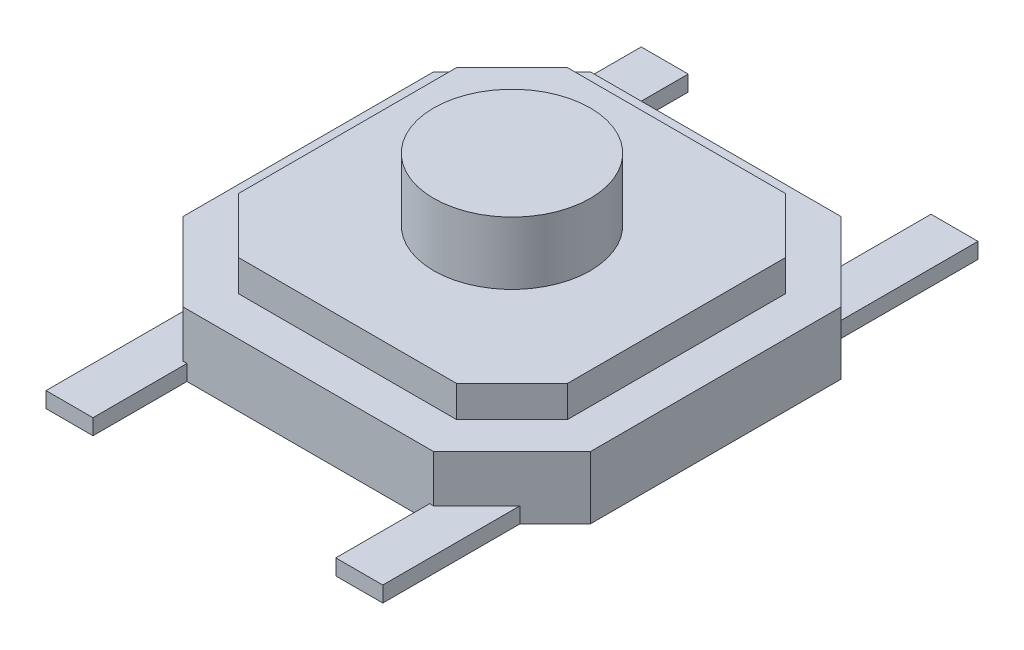
ISO-10303-21;
HEADER;
FILE_DESCRIPTION(('STEP AP214'),'2;1');
FILE_NAME('part.step','',(''),(''),'','','');
FILE_SCHEMA(('AUTOMOTIVE_DESIGN { 1 0 10303 214 1 1 1 1 }'));
ENDSEC;
DATA;
#1=APPLICATION_CONTEXT('core data for automotive mechanical design processes');
#2=APPLICATION_PROTOCOL_DEFINITION('international standard','automotive_design',2000,#1);
#3=PRODUCT_CONTEXT('',#1,'mechanical');
#4=PRODUCT('Part','Part','',(#3));
#5=PRODUCT_RELATED_PRODUCT_CATEGORY('part','',(#4));
#6=PRODUCT_DEFINITION_FORMATION('','',#4);
#7=PRODUCT_DEFINITION_CONTEXT('part definition',#1,'design');
#8=PRODUCT_DEFINITION('design','',#6,#7);
#9=PRODUCT_DEFINITION_SHAPE('','',#8);
#10=(LENGTH_UNIT() NAMED_UNIT(*) SI_UNIT(.MILLI.,.METRE.));
#11=(NAMED_UNIT(*) PLANE_ANGLE_UNIT() SI_UNIT($,.RADIAN.));
#12=(NAMED_UNIT(*) SI_UNIT($,.STERADIAN.) SOLID_ANGLE_UNIT());
#13=UNCERTAINTY_MEASURE_WITH_UNIT(LENGTH_MEASURE(1.E-05),#10,'distance_accuracy_value','');
#14=(GEOMETRIC_REPRESENTATION_CONTEXT(3) GLOBAL_UNCERTAINTY_ASSIGNED_CONTEXT((#13)) GLOBAL_UNIT_ASSIGNED_CONTEXT((#10,
#11,#12)) REPRESENTATION_CONTEXT('',''));
#15=CARTESIAN_POINT('',(0.,0.,0.));
#16=DIRECTION('',(0.,0.,1.));
#17=DIRECTION('',(1.,0.,0.));
#18=AXIS2_PLACEMENT_3D('',#15,#16,#17);
#19=CARTESIAN_POINT('',(-2.6,1.2,-2.60000000000001));
#20=DIRECTION('',(0.,1.,0.));
#21=DIRECTION('',(0.,0.,1.));
#22=AXIS2_PLACEMENT_3D('',#19,#20,#21);
#23=PLANE('',#22);
#24=DIRECTION('',(-1.,0.,0.));
#25=VECTOR('',#24,1.);
#26=CARTESIAN_POINT('',(1.39289321881345,1.2,-2.10000000000001));
#27=LINE('',#26,#25);
#28=CARTESIAN_POINT('',(1.39289321881345,1.2,-2.10000000000001));
#29=VERTEX_POINT('',#28);
#30=CARTESIAN_POINT('',(-1.39289321881345,1.2,-2.10000000000001));
#31=VERTEX_POINT('',#30);
#32=EDGE_CURVE('E363',#29,#31,#27,.T.);
#33=ORIENTED_EDGE('',*,*,#32,.T.);
#34=DIRECTION('',(-0.707106781186549,0.,0.707106781186546));
#35=VECTOR('',#34,1.);
#36=CARTESIAN_POINT('',(-1.39289321881345,1.2,-2.10000000000001));
#37=LINE('',#36,#35);
#38=CARTESIAN_POINT('',(-2.1,1.2,-1.39289321881346));
#39=VERTEX_POINT('',#38);
#40=EDGE_CURVE('E410',#31,#39,#37,.T.);
#41=ORIENTED_EDGE('',*,*,#40,.T.);
#42=DIRECTION('',(0.,0.,1.));
#43=VECTOR('',#42,1.);
#44=CARTESIAN_POINT('',(-2.1,1.2,-1.39289321881346));
#45=LINE('',#44,#43);
#46=CARTESIAN_POINT('',(-2.1,1.2,1.39289321881344));
#47=VERTEX_POINT('',#46);
#48=EDGE_CURVE('E407',#39,#47,#45,.T.);
#49=ORIENTED_EDGE('',*,*,#48,.T.);
#50=DIRECTION('',(0.707106781186546,0.,0.707106781186549));
#51=VECTOR('',#50,1.);
#52=CARTESIAN_POINT('',(-2.1,1.2,1.39289321881344));
#53=LINE('',#52,#51);
#54=CARTESIAN_POINT('',(-1.39289321881345,1.2,2.09999999999999));
#55=VERTEX_POINT('',#54);
#56=EDGE_CURVE('E404',#47,#55,#53,.T.);
#57=ORIENTED_EDGE('',*,*,#56,.T.);
#58=DIRECTION('',(1.,0.,0.));
#59=VECTOR('',#58,1.);
#60=CARTESIAN_POINT('',(-1.39289321881345,1.2,2.09999999999999));
#61=LINE('',#60,#59);
#62=CARTESIAN_POINT('',(1.39289321881347,1.2,2.09999999999999));
#63=VERTEX_POINT('',#62);
#64=EDGE_CURVE('E401',#55,#63,#61,.T.);
#65=ORIENTED_EDGE('',*,*,#64,.T.);
#66=DIRECTION('',(0.707106781186549,0.,-0.707106781186546));
#67=VECTOR('',#66,1.);
#68=CARTESIAN_POINT('',(1.39289321881347,1.2,2.09999999999999));
#69=LINE('',#68,#67);
#70=CARTESIAN_POINT('',(2.10000000000002,1.2,1.39289321881345));
#71=VERTEX_POINT('',#70);
#72=EDGE_CURVE('E398',#63,#71,#69,.T.);
#73=ORIENTED_EDGE('',*,*,#72,.T.);
#74=DIRECTION('',(0.,0.,-1.));
#75=VECTOR('',#74,1.);
#76=CARTESIAN_POINT('',(2.10000000000002,1.2,1.39289321881345));
#77=LINE('',#76,#75);
#78=CARTESIAN_POINT('',(2.1,1.2,-1.39289321881346));
#79=VERTEX_POINT('',#78);
#80=EDGE_CURVE('E395',#71,#79,#77,.T.);
#81=ORIENTED_EDGE('',*,*,#80,.T.);
#82=DIRECTION('',(-0.70710678118655,0.,-0.707106781186545));
#83=VECTOR('',#82,1.);
#84=CARTESIAN_POINT('',(2.1,1.2,-1.39289321881346));
#85=LINE('',#84,#83);
#86=EDGE_CURVE('E391',#79,#29,#85,.T.);
#87=ORIENTED_EDGE('',*,*,#86,.T.);
#88=EDGE_LOOP('',(#33,#41,#49,#57,#65,#73,#81,#87));
#89=FACE_BOUND('',#88,.T.);
#90=CARTESIAN_POINT('',(0.,1.2,0.));
#91=DIRECTION('',(0.,1.,0.));
#92=DIRECTION('',(0.,0.,1.));
#93=AXIS2_PLACEMENT_3D('',#90,#91,#92);
#94=CIRCLE('',#93,1.);
#95=CARTESIAN_POINT('',(0.,1.2,1.));
#96=VERTEX_POINT('',#95);
#97=EDGE_CURVE('E353',#96,#96,#94,.T.);
#98=ORIENTED_EDGE('',*,*,#97,.F.);
#99=EDGE_LOOP('',(#98));
#100=FACE_BOUND('',#99,.T.);
#101=ADVANCED_FACE('F35',(#89,#100),#23,.T.);
#102=CARTESIAN_POINT('',(-2.6,0.8,-2.60000000000001));
#103=DIRECTION('',(0.,1.,0.));
#104=DIRECTION('',(0.,0.,1.));
#105=AXIS2_PLACEMENT_3D('',#102,#103,#104);
#106=PLANE('',#105);
#107=DIRECTION('',(0.,0.,-1.));
#108=VECTOR('',#107,1.);
#109=CARTESIAN_POINT('',(2.6,0.8,-2.60000000000001));
#110=LINE('',#109,#108);
#111=CARTESIAN_POINT('',(2.60000000000002,0.8,1.6));
#112=VERTEX_POINT('',#111);
#113=CARTESIAN_POINT('',(2.6,0.8,-1.6));
#114=VERTEX_POINT('',#113);
#115=EDGE_CURVE('E431',#112,#114,#110,.T.);
#116=ORIENTED_EDGE('',*,*,#115,.T.);
#117=DIRECTION('',(0.70710678118655,0.,0.707106781186545));
#118=VECTOR('',#117,1.);
#119=CARTESIAN_POINT('',(-0.500000000000016,0.8,-4.7));
#120=LINE('',#119,#118);
#121=CARTESIAN_POINT('',(1.59999999999999,0.8,-2.60000000000001));
#122=VERTEX_POINT('',#121);
#123=EDGE_CURVE('E473',#114,#122,#120,.F.);
#124=ORIENTED_EDGE('',*,*,#123,.T.);
#125=DIRECTION('',(-1.,0.,0.));
#126=VECTOR('',#125,1.);
#127=CARTESIAN_POINT('',(-2.6,0.8,-2.60000000000001));
#128=LINE('',#127,#126);
#129=CARTESIAN_POINT('',(-1.6,0.8,-2.60000000000001));
#130=VERTEX_POINT('',#129);
#131=EDGE_CURVE('E434',#122,#130,#128,.T.);
#132=ORIENTED_EDGE('',*,*,#131,.T.);
#133=DIRECTION('',(0.707106781186549,0.,-0.707106781186546));
#134=VECTOR('',#133,1.);
#135=CARTESIAN_POINT('',(-2.1,0.8,-2.10000000000001));
#136=LINE('',#135,#134);
#137=CARTESIAN_POINT('',(-2.6,0.8,-1.60000000000001));
#138=VERTEX_POINT('',#137);
#139=EDGE_CURVE('E467',#130,#138,#136,.F.);
#140=ORIENTED_EDGE('',*,*,#139,.T.);
#141=DIRECTION('',(0.,0.,1.));
#142=VECTOR('',#141,1.);
#143=CARTESIAN_POINT('',(-2.6,0.8,-2.60000000000001));
#144=LINE('',#143,#142);
#145=CARTESIAN_POINT('',(-2.6,0.8,1.59999999999999));
#146=VERTEX_POINT('',#145);
#147=EDGE_CURVE('E424',#138,#146,#144,.T.);
#148=ORIENTED_EDGE('',*,*,#147,.T.);
#149=DIRECTION('',(-0.707106781186547,0.,-0.707106781186548));
#150=VECTOR('',#149,1.);
#151=CARTESIAN_POINT('',(-4.7,0.8,-0.500000000000014));
#152=LINE('',#151,#150);
#153=CARTESIAN_POINT('',(-1.6,0.8,2.59999999999999));
#154=VERTEX_POINT('',#153);
#155=EDGE_CURVE('E469',#146,#154,#152,.F.);
#156=ORIENTED_EDGE('',*,*,#155,.T.);
#157=DIRECTION('',(1.,0.,0.));
#158=VECTOR('',#157,1.);
#159=CARTESIAN_POINT('',(-2.6,0.8,2.59999999999999));
#160=LINE('',#159,#158);
#161=CARTESIAN_POINT('',(1.60000000000002,0.8,2.59999999999999));
#162=VERTEX_POINT('',#161);
#163=EDGE_CURVE('E427',#154,#162,#160,.T.);
#164=ORIENTED_EDGE('',*,*,#163,.T.);
#165=DIRECTION('',(-0.707106781186549,0.,0.707106781186546));
#166=VECTOR('',#165,1.);
#167=CARTESIAN_POINT('',(2.1,0.8,2.10000000000001));
#168=LINE('',#167,#166);
#169=EDGE_CURVE('E471',#162,#112,#168,.F.);
#170=ORIENTED_EDGE('',*,*,#169,.T.);
#171=EDGE_LOOP('',(#116,#124,#132,#140,#148,#156,#164,#170));
#172=FACE_BOUND('',#171,.T.);
#173=DIRECTION('',(0.,0.,1.));
#174=VECTOR('',#173,1.);
#175=CARTESIAN_POINT('',(-2.1,0.8,-1.39289321881346));
#176=LINE('',#175,#174);
#177=CARTESIAN_POINT('',(-2.1,0.8,-1.39289321881346));
#178=VERTEX_POINT('',#177);
#179=CARTESIAN_POINT('',(-2.1,0.8,1.39289321881344));
#180=VERTEX_POINT('',#179);
#181=EDGE_CURVE('E384',#178,#180,#176,.T.);
#182=ORIENTED_EDGE('',*,*,#181,.F.);
#183=DIRECTION('',(-0.707106781186549,0.,0.707106781186546));
#184=VECTOR('',#183,1.);
#185=CARTESIAN_POINT('',(-1.39289321881345,0.8,-2.10000000000001));
#186=LINE('',#185,#184);
#187=CARTESIAN_POINT('',(-1.39289321881345,0.8,-2.10000000000001));
#188=VERTEX_POINT('',#187);
#189=EDGE_CURVE('E388',#188,#178,#186,.T.);
#190=ORIENTED_EDGE('',*,*,#189,.F.);
#191=DIRECTION('',(-1.,0.,0.));
#192=VECTOR('',#191,1.);
#193=CARTESIAN_POINT('',(1.39289321881345,0.8,-2.10000000000001));
#194=LINE('',#193,#192);
#195=CARTESIAN_POINT('',(1.39289321881345,0.8,-2.10000000000001));
#196=VERTEX_POINT('',#195);
#197=EDGE_CURVE('E360',#196,#188,#194,.T.);
#198=ORIENTED_EDGE('',*,*,#197,.F.);
#199=DIRECTION('',(-0.70710678118655,0.,-0.707106781186545));
#200=VECTOR('',#199,1.);
#201=CARTESIAN_POINT('',(2.1,0.8,-1.39289321881346));
#202=LINE('',#201,#200);
#203=CARTESIAN_POINT('',(2.1,0.8,-1.39289321881346));
#204=VERTEX_POINT('',#203);
#205=EDGE_CURVE('E365',#204,#196,#202,.T.);
#206=ORIENTED_EDGE('',*,*,#205,.F.);
#207=DIRECTION('',(0.,0.,-1.));
#208=VECTOR('',#207,1.);
#209=CARTESIAN_POINT('',(2.10000000000002,0.8,1.39289321881345));
#210=LINE('',#209,#208);
#211=CARTESIAN_POINT('',(2.10000000000002,0.8,1.39289321881345));
#212=VERTEX_POINT('',#211);
#213=EDGE_CURVE('E368',#212,#204,#210,.T.);
#214=ORIENTED_EDGE('',*,*,#213,.F.);
#215=DIRECTION('',(0.707106781186549,0.,-0.707106781186546));
#216=VECTOR('',#215,1.);
#217=CARTESIAN_POINT('',(1.39289321881347,0.8,2.09999999999999));
#218=LINE('',#217,#216);
#219=CARTESIAN_POINT('',(1.39289321881347,0.8,2.09999999999999));
#220=VERTEX_POINT('',#219);
#221=EDGE_CURVE('E372',#220,#212,#218,.T.);
#222=ORIENTED_EDGE('',*,*,#221,.F.);
#223=DIRECTION('',(1.,0.,0.));
#224=VECTOR('',#223,1.);
#225=CARTESIAN_POINT('',(-1.39289321881345,0.8,2.09999999999999));
#226=LINE('',#225,#224);
#227=CARTESIAN_POINT('',(-1.39289321881345,0.8,2.09999999999999));
#228=VERTEX_POINT('',#227);
#229=EDGE_CURVE('E376',#228,#220,#226,.T.);
#230=ORIENTED_EDGE('',*,*,#229,.F.);
#231=DIRECTION('',(0.707106781186546,0.,0.707106781186549));
#232=VECTOR('',#231,1.);
#233=CARTESIAN_POINT('',(-2.1,0.8,1.39289321881344));
#234=LINE('',#233,#232);
#235=EDGE_CURVE('E380',#180,#228,#234,.T.);
#236=ORIENTED_EDGE('',*,*,#235,.F.);
#237=EDGE_LOOP('',(#182,#190,#198,#206,#214,#222,#230,#236));
#238=FACE_BOUND('',#237,.T.);
#239=ADVANCED_FACE('F519',(#172,#238),#106,.T.);
#240=CARTESIAN_POINT('',(-2.6,0.8,-2.60000000000001));
#241=DIRECTION('',(1.,0.,0.));
#242=DIRECTION('',(0.,0.,-1.));
#243=AXIS2_PLACEMENT_3D('',#240,#241,#242);
#244=PLANE('',#243);
#245=DIRECTION('',(0.,0.,1.));
#246=VECTOR('',#245,1.);
#247=CARTESIAN_POINT('',(-2.6,0.,-2.60000000000001));
#248=LINE('',#247,#246);
#249=CARTESIAN_POINT('',(-2.6,0.,-1.60000000000001));
#250=VERTEX_POINT('',#249);
#251=CARTESIAN_POINT('',(-2.6,0.,1.59999999999999));
#252=VERTEX_POINT('',#251);
#253=EDGE_CURVE('E394',#250,#252,#248,.T.);
#254=ORIENTED_EDGE('',*,*,#253,.T.);
#255=DIRECTION('',(0.,1.,0.));
#256=VECTOR('',#255,1.);
#257=CARTESIAN_POINT('',(-2.6,0.8,1.59999999999999));
#258=LINE('',#257,#256);
#259=EDGE_CURVE('E483',#252,#146,#258,.T.);
#260=ORIENTED_EDGE('',*,*,#259,.T.);
#261=ORIENTED_EDGE('',*,*,#147,.F.);
#262=DIRECTION('',(0.,-1.,0.));
#263=VECTOR('',#262,1.);
#264=CARTESIAN_POINT('',(-2.6,0.8,-1.60000000000001));
#265=LINE('',#264,#263);
#266=EDGE_CURVE('E480',#138,#250,#265,.T.);
#267=ORIENTED_EDGE('',*,*,#266,.T.);
#268=EDGE_LOOP('',(#254,#260,#261,#267));
#269=FACE_BOUND('',#268,.T.);
#270=ADVANCED_FACE('F515',(#269),#244,.F.);
#271=CARTESIAN_POINT('',(-2.6,0.8,2.59999999999999));
#272=DIRECTION('',(0.,0.,-1.));
#273=DIRECTION('',(-1.,0.,0.));
#274=AXIS2_PLACEMENT_3D('',#271,#272,#273);
#275=PLANE('',#274);
#276=DIRECTION('',(1.,0.,0.));
#277=VECTOR('',#276,1.);
#278=CARTESIAN_POINT('',(-2.6,0.,2.59999999999999));
#279=LINE('',#278,#277);
#280=CARTESIAN_POINT('',(-1.55,0.,2.59999999999999));
#281=VERTEX_POINT('',#280);
#282=CARTESIAN_POINT('',(1.55,0.,2.59999999999999));
#283=VERTEX_POINT('',#282);
#284=EDGE_CURVE('E440',#281,#283,#279,.T.);
#285=ORIENTED_EDGE('',*,*,#284,.T.);
#286=DIRECTION('',(0.,1.,0.));
#287=VECTOR('',#286,1.);
#288=CARTESIAN_POINT('',(1.55,0.8,2.59999999999999));
#289=LINE('',#288,#287);
#290=CARTESIAN_POINT('',(1.55,0.2,2.59999999999999));
#291=VERTEX_POINT('',#290);
#292=EDGE_CURVE('E327',#283,#291,#289,.T.);
#293=ORIENTED_EDGE('',*,*,#292,.T.);
#294=DIRECTION('',(-1.,0.,0.));
#295=VECTOR('',#294,1.);
#296=CARTESIAN_POINT('',(-2.6,0.2,2.59999999999999));
#297=LINE('',#296,#295);
#298=CARTESIAN_POINT('',(1.60000000000002,0.2,2.59999999999999));
#299=VERTEX_POINT('',#298);
#300=EDGE_CURVE('E323',#299,#291,#297,.T.);
#301=ORIENTED_EDGE('',*,*,#300,.F.);
#302=DIRECTION('',(0.,1.,0.));
#303=VECTOR('',#302,1.);
#304=CARTESIAN_POINT('',(1.60000000000002,0.8,2.59999999999999));
#305=LINE('',#304,#303);
#306=EDGE_CURVE('E478',#299,#162,#305,.T.);
#307=ORIENTED_EDGE('',*,*,#306,.T.);
#308=ORIENTED_EDGE('',*,*,#163,.F.);
#309=DIRECTION('',(0.,-1.,0.));
#310=VECTOR('',#309,1.);
#311=CARTESIAN_POINT('',(-1.6,0.8,2.59999999999999));
#312=LINE('',#311,#310);
#313=CARTESIAN_POINT('',(-1.6,0.2,2.59999999999999));
#314=VERTEX_POINT('',#313);
#315=EDGE_CURVE('E475',#154,#314,#312,.T.);
#316=ORIENTED_EDGE('',*,*,#315,.T.);
#317=DIRECTION('',(-1.,0.,0.));
#318=VECTOR('',#317,1.);
#319=CARTESIAN_POINT('',(-2.6,0.2,2.59999999999999));
#320=LINE('',#319,#318);
#321=CARTESIAN_POINT('',(-1.55,0.2,2.59999999999999));
#322=VERTEX_POINT('',#321);
#323=EDGE_CURVE('E346',#322,#314,#320,.T.);
#324=ORIENTED_EDGE('',*,*,#323,.F.);
#325=DIRECTION('',(0.,-1.,0.));
#326=VECTOR('',#325,1.);
#327=CARTESIAN_POINT('',(-1.55,0.8,2.59999999999999));
#328=LINE('',#327,#326);
#329=EDGE_CURVE('E350',#322,#281,#328,.T.);
#330=ORIENTED_EDGE('',*,*,#329,.T.);
#331=EDGE_LOOP('',(#285,#293,#301,#307,#308,#316,#324,#330));
#332=FACE_BOUND('',#331,.T.);
#333=ADVANCED_FACE('F529',(#332),#275,.F.);
#334=CARTESIAN_POINT('',(2.6,0.8,-2.60000000000001));
#335=DIRECTION('',(-1.,0.,0.));
#336=DIRECTION('',(0.,0.,1.));
#337=AXIS2_PLACEMENT_3D('',#334,#335,#336);
#338=PLANE('',#337);
#339=DIRECTION('',(0.,0.,-1.));
#340=VECTOR('',#339,1.);
#341=CARTESIAN_POINT('',(2.6,0.,-2.60000000000001));
#342=LINE('',#341,#340);
#343=CARTESIAN_POINT('',(2.60000000000002,0.,1.6));
#344=VERTEX_POINT('',#343);
#345=CARTESIAN_POINT('',(2.6,0.,-1.6));
#346=VERTEX_POINT('',#345);
#347=EDGE_CURVE('E443',#344,#346,#342,.T.);
#348=ORIENTED_EDGE('',*,*,#347,.T.);
#349=DIRECTION('',(0.,1.,0.));
#350=VECTOR('',#349,1.);
#351=CARTESIAN_POINT('',(2.6,0.8,-1.6));
#352=LINE('',#351,#350);
#353=EDGE_CURVE('E465',#346,#114,#352,.T.);
#354=ORIENTED_EDGE('',*,*,#353,.T.);
#355=ORIENTED_EDGE('',*,*,#115,.F.);
#356=DIRECTION('',(0.,-1.,0.));
#357=VECTOR('',#356,1.);
#358=CARTESIAN_POINT('',(2.60000000000002,0.8,1.6));
#359=LINE('',#358,#357);
#360=EDGE_CURVE('E462',#112,#344,#359,.T.);
#361=ORIENTED_EDGE('',*,*,#360,.T.);
#362=EDGE_LOOP('',(#348,#354,#355,#361));
#363=FACE_BOUND('',#362,.T.);
#364=ADVANCED_FACE('F540',(#363),#338,.F.);
#365=CARTESIAN_POINT('',(-2.6,0.8,-2.60000000000001));
#366=DIRECTION('',(0.,0.,1.));
#367=DIRECTION('',(1.,0.,0.));
#368=AXIS2_PLACEMENT_3D('',#365,#366,#367);
#369=PLANE('',#368);
#370=DIRECTION('',(-1.,0.,0.));
#371=VECTOR('',#370,1.);
#372=CARTESIAN_POINT('',(-2.6,0.,-2.60000000000001));
#373=LINE('',#372,#371);
#374=CARTESIAN_POINT('',(1.55,0.,-2.60000000000001));
#375=VERTEX_POINT('',#374);
#376=CARTESIAN_POINT('',(-1.55,0.,-2.60000000000001));
#377=VERTEX_POINT('',#376);
#378=EDGE_CURVE('E428',#375,#377,#373,.T.);
#379=ORIENTED_EDGE('',*,*,#378,.T.);
#380=DIRECTION('',(0.,1.,0.));
#381=VECTOR('',#380,1.);
#382=CARTESIAN_POINT('',(-1.55,0.8,-2.60000000000001));
#383=LINE('',#382,#381);
#384=CARTESIAN_POINT('',(-1.55,0.2,-2.60000000000001));
#385=VERTEX_POINT('',#384);
#386=EDGE_CURVE('E278',#377,#385,#383,.T.);
#387=ORIENTED_EDGE('',*,*,#386,.T.);
#388=DIRECTION('',(1.,0.,0.));
#389=VECTOR('',#388,1.);
#390=CARTESIAN_POINT('',(-2.6,0.2,-2.60000000000001));
#391=LINE('',#390,#389);
#392=CARTESIAN_POINT('',(-1.6,0.2,-2.60000000000001));
#393=VERTEX_POINT('',#392);
#394=EDGE_CURVE('E275',#393,#385,#391,.T.);
#395=ORIENTED_EDGE('',*,*,#394,.F.);
#396=DIRECTION('',(0.,1.,0.));
#397=VECTOR('',#396,1.);
#398=CARTESIAN_POINT('',(-1.6,0.8,-2.60000000000001));
#399=LINE('',#398,#397);
#400=EDGE_CURVE('E437',#393,#130,#399,.T.);
#401=ORIENTED_EDGE('',*,*,#400,.T.);
#402=ORIENTED_EDGE('',*,*,#131,.F.);
#403=DIRECTION('',(0.,-1.,0.));
#404=VECTOR('',#403,1.);
#405=CARTESIAN_POINT('',(1.59999999999999,0.8,-2.60000000000001));
#406=LINE('',#405,#404);
#407=CARTESIAN_POINT('',(1.59999999999999,0.2,-2.60000000000001));
#408=VERTEX_POINT('',#407);
#409=EDGE_CURVE('E449',#122,#408,#406,.T.);
#410=ORIENTED_EDGE('',*,*,#409,.T.);
#411=DIRECTION('',(1.,0.,0.));
#412=VECTOR('',#411,1.);
#413=CARTESIAN_POINT('',(-2.6,0.2,-2.60000000000001));
#414=LINE('',#413,#412);
#415=CARTESIAN_POINT('',(1.55,0.2,-2.60000000000001));
#416=VERTEX_POINT('',#415);
#417=EDGE_CURVE('E297',#416,#408,#414,.T.);
#418=ORIENTED_EDGE('',*,*,#417,.F.);
#419=DIRECTION('',(0.,-1.,0.));
#420=VECTOR('',#419,1.);
#421=CARTESIAN_POINT('',(1.55,0.8,-2.60000000000001));
#422=LINE('',#421,#420);
#423=EDGE_CURVE('E301',#416,#375,#422,.T.);
#424=ORIENTED_EDGE('',*,*,#423,.T.);
#425=EDGE_LOOP('',(#379,#387,#395,#401,#402,#410,#418,#424));
#426=FACE_BOUND('',#425,.T.);
#427=ADVANCED_FACE('F504',(#426),#369,.F.);
#428=CARTESIAN_POINT('',(-2.6,0.,-2.60000000000001));
#429=DIRECTION('',(0.,1.,0.));
#430=DIRECTION('',(0.,0.,1.));
#431=AXIS2_PLACEMENT_3D('',#428,#429,#430);
#432=PLANE('',#431);
#433=DIRECTION('',(0.,0.,1.));
#434=VECTOR('',#433,1.);
#435=CARTESIAN_POINT('',(-1.55,0.,-1.13168776971169));
#436=LINE('',#435,#434);
#437=CARTESIAN_POINT('',(-1.55,0.,-3.79999999999999));
#438=VERTEX_POINT('',#437);
#439=EDGE_CURVE('E254',#438,#377,#436,.T.);
#440=ORIENTED_EDGE('',*,*,#439,.T.);
#441=ORIENTED_EDGE('',*,*,#378,.F.);
#442=DIRECTION('',(0.,0.,-1.));
#443=VECTOR('',#442,1.);
#444=CARTESIAN_POINT('',(1.55,0.,-1.13168776971169));
#445=LINE('',#444,#443);
#446=CARTESIAN_POINT('',(1.55,0.,-3.79999999999999));
#447=VERTEX_POINT('',#446);
#448=EDGE_CURVE('E281',#375,#447,#445,.T.);
#449=ORIENTED_EDGE('',*,*,#448,.T.);
#450=DIRECTION('',(1.,0.,0.));
#451=VECTOR('',#450,1.);
#452=CARTESIAN_POINT('',(1.55,0.,-3.79999999999999));
#453=LINE('',#452,#451);
#454=CARTESIAN_POINT('',(2.15,0.,-3.79999999999999));
#455=VERTEX_POINT('',#454);
#456=EDGE_CURVE('E292',#447,#455,#453,.T.);
#457=ORIENTED_EDGE('',*,*,#456,.T.);
#458=DIRECTION('',(0.,0.,1.));
#459=VECTOR('',#458,1.);
#460=CARTESIAN_POINT('',(2.15,0.,-1.13168776971169));
#461=LINE('',#460,#459);
#462=CARTESIAN_POINT('',(2.15,0.,-2.05000000000001));
#463=VERTEX_POINT('',#462);
#464=EDGE_CURVE('E50',#455,#463,#461,.T.);
#465=ORIENTED_EDGE('',*,*,#464,.T.);
#466=DIRECTION('',(-0.70710678118655,0.,-0.707106781186545));
#467=VECTOR('',#466,1.);
#468=CARTESIAN_POINT('',(1.59999999999999,0.,-2.60000000000001));
#469=LINE('',#468,#467);
#470=EDGE_CURVE('E460',#463,#346,#469,.F.);
#471=ORIENTED_EDGE('',*,*,#470,.T.);
#472=ORIENTED_EDGE('',*,*,#347,.F.);
#473=DIRECTION('',(0.707106781186549,0.,-0.707106781186546));
#474=VECTOR('',#473,1.);
#475=CARTESIAN_POINT('',(2.60000000000002,0.,1.6));
#476=LINE('',#475,#474);
#477=CARTESIAN_POINT('',(2.15,0.,2.05000000000001));
#478=VERTEX_POINT('',#477);
#479=EDGE_CURVE('E457',#344,#478,#476,.F.);
#480=ORIENTED_EDGE('',*,*,#479,.T.);
#481=DIRECTION('',(0.,0.,1.));
#482=VECTOR('',#481,1.);
#483=CARTESIAN_POINT('',(2.15,0.,1.13168776971169));
#484=LINE('',#483,#482);
#485=CARTESIAN_POINT('',(2.15,0.,3.79999999999999));
#486=VERTEX_POINT('',#485);
#487=EDGE_CURVE('E304',#478,#486,#484,.T.);
#488=ORIENTED_EDGE('',*,*,#487,.T.);
#489=DIRECTION('',(-1.,0.,0.));
#490=VECTOR('',#489,1.);
#491=CARTESIAN_POINT('',(1.55,0.,3.79999999999999));
#492=LINE('',#491,#490);
#493=CARTESIAN_POINT('',(1.55,0.,3.79999999999999));
#494=VERTEX_POINT('',#493);
#495=EDGE_CURVE('E316',#486,#494,#492,.T.);
#496=ORIENTED_EDGE('',*,*,#495,.T.);
#497=DIRECTION('',(0.,0.,-1.));
#498=VECTOR('',#497,1.);
#499=CARTESIAN_POINT('',(1.55,0.,1.13168776971169));
#500=LINE('',#499,#498);
#501=EDGE_CURVE('E308',#494,#283,#500,.T.);
#502=ORIENTED_EDGE('',*,*,#501,.T.);
#503=ORIENTED_EDGE('',*,*,#284,.F.);
#504=DIRECTION('',(0.,0.,1.));
#505=VECTOR('',#504,1.);
#506=CARTESIAN_POINT('',(-1.55,0.,1.13168776971169));
#507=LINE('',#506,#505);
#508=CARTESIAN_POINT('',(-1.55,0.,3.79999999999999));
#509=VERTEX_POINT('',#508);
#510=EDGE_CURVE('E330',#281,#509,#507,.T.);
#511=ORIENTED_EDGE('',*,*,#510,.T.);
#512=DIRECTION('',(-1.,0.,0.));
#513=VECTOR('',#512,1.);
#514=CARTESIAN_POINT('',(-1.55,0.,3.79999999999999));
#515=LINE('',#514,#513);
#516=CARTESIAN_POINT('',(-2.15,0.,3.79999999999999));
#517=VERTEX_POINT('',#516);
#518=EDGE_CURVE('E341',#509,#517,#515,.T.);
#519=ORIENTED_EDGE('',*,*,#518,.T.);
#520=DIRECTION('',(0.,0.,-1.));
#521=VECTOR('',#520,1.);
#522=CARTESIAN_POINT('',(-2.15,0.,1.13168776971169));
#523=LINE('',#522,#521);
#524=CARTESIAN_POINT('',(-2.15,0.,2.04999999999999));
#525=VERTEX_POINT('',#524);
#526=EDGE_CURVE('E57',#517,#525,#523,.T.);
#527=ORIENTED_EDGE('',*,*,#526,.T.);
#528=DIRECTION('',(0.707106781186547,0.,0.707106781186548));
#529=VECTOR('',#528,1.);
#530=CARTESIAN_POINT('',(-1.6,0.,2.59999999999999));
#531=LINE('',#530,#529);
#532=EDGE_CURVE('E455',#525,#252,#531,.F.);
#533=ORIENTED_EDGE('',*,*,#532,.T.);
#534=ORIENTED_EDGE('',*,*,#253,.F.);
#535=DIRECTION('',(-0.707106781186549,0.,0.707106781186546));
#536=VECTOR('',#535,1.);
#537=CARTESIAN_POINT('',(-2.6,0.,-1.60000000000001));
#538=LINE('',#537,#536);
#539=CARTESIAN_POINT('',(-2.15,0.,-2.05000000000001));
#540=VERTEX_POINT('',#539);
#541=EDGE_CURVE('E452',#250,#540,#538,.F.);
#542=ORIENTED_EDGE('',*,*,#541,.T.);
#543=DIRECTION('',(0.,0.,-1.));
#544=VECTOR('',#543,1.);
#545=CARTESIAN_POINT('',(-2.15,0.,-1.13168776971169));
#546=LINE('',#545,#544);
#547=CARTESIAN_POINT('',(-2.15,0.,-3.79999999999999));
#548=VERTEX_POINT('',#547);
#549=EDGE_CURVE('E270',#540,#548,#546,.T.);
#550=ORIENTED_EDGE('',*,*,#549,.T.);
#551=DIRECTION('',(1.,0.,0.));
#552=VECTOR('',#551,1.);
#553=CARTESIAN_POINT('',(-1.55,0.,-3.79999999999999));
#554=LINE('',#553,#552);
#555=EDGE_CURVE('E261',#548,#438,#554,.T.);
#556=ORIENTED_EDGE('',*,*,#555,.T.);
#557=EDGE_LOOP('',(#440,#441,#449,#457,#465,#471,#472,#480,#488,#496,#502,#503,#511,#519,#527,
#533,#534,#542,#550,#556));
#558=FACE_BOUND('',#557,.T.);
#559=ADVANCED_FACE('F510',(#558),#432,.F.);
#560=CARTESIAN_POINT('',(1.59999999999999,0.8,-2.60000000000001));
#561=DIRECTION('',(-0.707106781186545,0.,0.70710678118655));
#562=DIRECTION('',(0.,-1.,0.));
#563=AXIS2_PLACEMENT_3D('',#560,#561,#562);
#564=PLANE('',#563);
#565=DIRECTION('',(0.,1.,0.));
#566=VECTOR('',#565,1.);
#567=CARTESIAN_POINT('',(2.15,0.8,-2.05000000000001));
#568=LINE('',#567,#566);
#569=CARTESIAN_POINT('',(2.15,0.2,-2.05000000000001));
#570=VERTEX_POINT('',#569);
#571=EDGE_CURVE('E498',#570,#463,#568,.F.);
#572=ORIENTED_EDGE('',*,*,#571,.F.);
#573=DIRECTION('',(0.70710678118655,0.,0.707106781186545));
#574=VECTOR('',#573,1.);
#575=CARTESIAN_POINT('',(1.59999999999999,0.2,-2.60000000000001));
#576=LINE('',#575,#574);
#577=EDGE_CURVE('E495',#570,#408,#576,.F.);
#578=ORIENTED_EDGE('',*,*,#577,.T.);
#579=ORIENTED_EDGE('',*,*,#409,.F.);
#580=ORIENTED_EDGE('',*,*,#123,.F.);
#581=ORIENTED_EDGE('',*,*,#353,.F.);
#582=ORIENTED_EDGE('',*,*,#470,.F.);
#583=EDGE_LOOP('',(#572,#578,#579,#580,#581,#582));
#584=FACE_BOUND('',#583,.T.);
#585=ADVANCED_FACE('F545',(#584),#564,.F.);
#586=CARTESIAN_POINT('',(2.60000000000002,0.8,1.6));
#587=DIRECTION('',(-0.707106781186546,0.,-0.707106781186549));
#588=DIRECTION('',(0.,-1.,0.));
#589=AXIS2_PLACEMENT_3D('',#586,#587,#588);
#590=PLANE('',#589);
#591=DIRECTION('',(0.,-1.,0.));
#592=VECTOR('',#591,1.);
#593=CARTESIAN_POINT('',(2.15,0.8,2.05000000000001));
#594=LINE('',#593,#592);
#595=CARTESIAN_POINT('',(2.15,0.2,2.05000000000001));
#596=VERTEX_POINT('',#595);
#597=EDGE_CURVE('E493',#478,#596,#594,.F.);
#598=ORIENTED_EDGE('',*,*,#597,.F.);
#599=ORIENTED_EDGE('',*,*,#479,.F.);
#600=ORIENTED_EDGE('',*,*,#360,.F.);
#601=ORIENTED_EDGE('',*,*,#169,.F.);
#602=ORIENTED_EDGE('',*,*,#306,.F.);
#603=DIRECTION('',(-0.707106781186549,0.,0.707106781186546));
#604=VECTOR('',#603,1.);
#605=CARTESIAN_POINT('',(2.60000000000002,0.2,1.6));
#606=LINE('',#605,#604);
#607=EDGE_CURVE('E490',#299,#596,#606,.F.);
#608=ORIENTED_EDGE('',*,*,#607,.T.);
#609=EDGE_LOOP('',(#598,#599,#600,#601,#602,#608));
#610=FACE_BOUND('',#609,.T.);
#611=ADVANCED_FACE('F537',(#610),#590,.F.);
#612=CARTESIAN_POINT('',(-1.6,0.8,2.59999999999999));
#613=DIRECTION('',(0.707106781186548,0.,-0.707106781186547));
#614=DIRECTION('',(0.,-1.,0.));
#615=AXIS2_PLACEMENT_3D('',#612,#613,#614);
#616=PLANE('',#615);
#617=DIRECTION('',(0.,1.,0.));
#618=VECTOR('',#617,1.);
#619=CARTESIAN_POINT('',(-2.15,0.8,2.04999999999999));
#620=LINE('',#619,#618);
#621=CARTESIAN_POINT('',(-2.15,0.2,2.04999999999999));
#622=VERTEX_POINT('',#621);
#623=EDGE_CURVE('E488',#622,#525,#620,.F.);
#624=ORIENTED_EDGE('',*,*,#623,.F.);
#625=DIRECTION('',(-0.707106781186547,0.,-0.707106781186548));
#626=VECTOR('',#625,1.);
#627=CARTESIAN_POINT('',(-1.6,0.2,2.59999999999999));
#628=LINE('',#627,#626);
#629=EDGE_CURVE('E485',#622,#314,#628,.F.);
#630=ORIENTED_EDGE('',*,*,#629,.T.);
#631=ORIENTED_EDGE('',*,*,#315,.F.);
#632=ORIENTED_EDGE('',*,*,#155,.F.);
#633=ORIENTED_EDGE('',*,*,#259,.F.);
#634=ORIENTED_EDGE('',*,*,#532,.F.);
#635=EDGE_LOOP('',(#624,#630,#631,#632,#633,#634));
#636=FACE_BOUND('',#635,.T.);
#637=ADVANCED_FACE('F525',(#636),#616,.F.);
#638=CARTESIAN_POINT('',(-2.6,0.8,-1.60000000000001));
#639=DIRECTION('',(0.707106781186546,0.,0.707106781186549));
#640=DIRECTION('',(0.,-1.,0.));
#641=AXIS2_PLACEMENT_3D('',#638,#639,#640);
#642=PLANE('',#641);
#643=DIRECTION('',(0.,-1.,0.));
#644=VECTOR('',#643,1.);
#645=CARTESIAN_POINT('',(-2.15,0.8,-2.05000000000001));
#646=LINE('',#645,#644);
#647=CARTESIAN_POINT('',(-2.15,0.2,-2.05000000000001));
#648=VERTEX_POINT('',#647);
#649=EDGE_CURVE('E12',#540,#648,#646,.F.);
#650=ORIENTED_EDGE('',*,*,#649,.F.);
#651=ORIENTED_EDGE('',*,*,#541,.F.);
#652=ORIENTED_EDGE('',*,*,#266,.F.);
#653=ORIENTED_EDGE('',*,*,#139,.F.);
#654=ORIENTED_EDGE('',*,*,#400,.F.);
#655=DIRECTION('',(0.707106781186549,0.,-0.707106781186546));
#656=VECTOR('',#655,1.);
#657=CARTESIAN_POINT('',(-2.6,0.2,-1.60000000000001));
#658=LINE('',#657,#656);
#659=EDGE_CURVE('E43',#393,#648,#658,.F.);
#660=ORIENTED_EDGE('',*,*,#659,.T.);
#661=EDGE_LOOP('',(#650,#651,#652,#653,#654,#660));
#662=FACE_BOUND('',#661,.T.);
#663=ADVANCED_FACE('F37',(#662),#642,.F.);
#664=CARTESIAN_POINT('',(-1.39289321881345,8.33969696196701,-2.10000000000001));
#665=DIRECTION('',(0.707106781186546,0.,0.707106781186549));
#666=DIRECTION('',(0.707106781186549,0.,-0.707106781186546));
#667=AXIS2_PLACEMENT_3D('',#664,#665,#666);
#668=PLANE('',#667);
#669=ORIENTED_EDGE('',*,*,#40,.F.);
#670=DIRECTION('',(0.,-1.,0.));
#671=VECTOR('',#670,1.);
#672=CARTESIAN_POINT('',(-1.39289321881345,8.33969696196701,-2.10000000000001));
#673=LINE('',#672,#671);
#674=EDGE_CURVE('E359',#31,#188,#673,.T.);
#675=ORIENTED_EDGE('',*,*,#674,.T.);
#676=ORIENTED_EDGE('',*,*,#189,.T.);
#677=DIRECTION('',(0.,-1.,0.));
#678=VECTOR('',#677,1.);
#679=CARTESIAN_POINT('',(-2.1,8.33969696196701,-1.39289321881346));
#680=LINE('',#679,#678);
#681=EDGE_CURVE('E387',#39,#178,#680,.T.);
#682=ORIENTED_EDGE('',*,*,#681,.F.);
#683=EDGE_LOOP('',(#669,#675,#676,#682));
#684=FACE_BOUND('',#683,.T.);
#685=ADVANCED_FACE('F584',(#684),#668,.F.);
#686=CARTESIAN_POINT('',(-2.1,8.33969696196701,-1.39289321881346));
#687=DIRECTION('',(1.,0.,0.));
#688=DIRECTION('',(0.,0.,-1.));
#689=AXIS2_PLACEMENT_3D('',#686,#687,#688);
#690=PLANE('',#689);
#691=ORIENTED_EDGE('',*,*,#48,.F.);
#692=ORIENTED_EDGE('',*,*,#681,.T.);
#693=ORIENTED_EDGE('',*,*,#181,.T.);
#694=DIRECTION('',(0.,-1.,0.));
#695=VECTOR('',#694,1.);
#696=CARTESIAN_POINT('',(-2.1,8.33969696196701,1.39289321881344));
#697=LINE('',#696,#695);
#698=EDGE_CURVE('E383',#47,#180,#697,.T.);
#699=ORIENTED_EDGE('',*,*,#698,.F.);
#700=EDGE_LOOP('',(#691,#692,#693,#699));
#701=FACE_BOUND('',#700,.T.);
#702=ADVANCED_FACE('F607',(#701),#690,.F.);
#703=CARTESIAN_POINT('',(-2.1,8.33969696196701,1.39289321881344));
#704=DIRECTION('',(0.707106781186549,0.,-0.707106781186546));
#705=DIRECTION('',(-0.707106781186546,0.,-0.707106781186549));
#706=AXIS2_PLACEMENT_3D('',#703,#704,#705);
#707=PLANE('',#706);
#708=ORIENTED_EDGE('',*,*,#56,.F.);
#709=ORIENTED_EDGE('',*,*,#698,.T.);
#710=ORIENTED_EDGE('',*,*,#235,.T.);
#711=DIRECTION('',(0.,-1.,0.));
#712=VECTOR('',#711,1.);
#713=CARTESIAN_POINT('',(-1.39289321881345,8.33969696196701,2.09999999999999));
#714=LINE('',#713,#712);
#715=EDGE_CURVE('E379',#55,#228,#714,.T.);
#716=ORIENTED_EDGE('',*,*,#715,.F.);
#717=EDGE_LOOP('',(#708,#709,#710,#716));
#718=FACE_BOUND('',#717,.T.);
#719=ADVANCED_FACE('F612',(#718),#707,.F.);
#720=CARTESIAN_POINT('',(-1.39289321881345,8.33969696196701,2.09999999999999));
#721=DIRECTION('',(0.,0.,-1.));
#722=DIRECTION('',(-1.,0.,0.));
#723=AXIS2_PLACEMENT_3D('',#720,#721,#722);
#724=PLANE('',#723);
#725=ORIENTED_EDGE('',*,*,#64,.F.);
#726=ORIENTED_EDGE('',*,*,#715,.T.);
#727=ORIENTED_EDGE('',*,*,#229,.T.);
#728=DIRECTION('',(0.,-1.,0.));
#729=VECTOR('',#728,1.);
#730=CARTESIAN_POINT('',(1.39289321881347,8.33969696196701,2.09999999999999));
#731=LINE('',#730,#729);
#732=EDGE_CURVE('E375',#63,#220,#731,.T.);
#733=ORIENTED_EDGE('',*,*,#732,.F.);
#734=EDGE_LOOP('',(#725,#726,#727,#733));
#735=FACE_BOUND('',#734,.T.);
#736=ADVANCED_FACE('F629',(#735),#724,.F.);
#737=CARTESIAN_POINT('',(1.39289321881347,8.33969696196701,2.09999999999999));
#738=DIRECTION('',(-0.707106781186546,0.,-0.707106781186549));
#739=DIRECTION('',(-0.707106781186549,0.,0.707106781186546));
#740=AXIS2_PLACEMENT_3D('',#737,#738,#739);
#741=PLANE('',#740);
#742=ORIENTED_EDGE('',*,*,#72,.F.);
#743=ORIENTED_EDGE('',*,*,#732,.T.);
#744=ORIENTED_EDGE('',*,*,#221,.T.);
#745=DIRECTION('',(0.,-1.,0.));
#746=VECTOR('',#745,1.);
#747=CARTESIAN_POINT('',(2.10000000000002,8.33969696196701,1.39289321881345));
#748=LINE('',#747,#746);
#749=EDGE_CURVE('E371',#71,#212,#748,.T.);
#750=ORIENTED_EDGE('',*,*,#749,.F.);
#751=EDGE_LOOP('',(#742,#743,#744,#750));
#752=FACE_BOUND('',#751,.T.);
#753=ADVANCED_FACE('F633',(#752),#741,.F.);
#754=CARTESIAN_POINT('',(2.10000000000002,8.33969696196701,1.39289321881345));
#755=DIRECTION('',(-1.,0.,0.));
#756=DIRECTION('',(0.,0.,1.));
#757=AXIS2_PLACEMENT_3D('',#754,#755,#756);
#758=PLANE('',#757);
#759=ORIENTED_EDGE('',*,*,#80,.F.);
#760=ORIENTED_EDGE('',*,*,#749,.T.);
#761=ORIENTED_EDGE('',*,*,#213,.T.);
#762=DIRECTION('',(0.,-1.,0.));
#763=VECTOR('',#762,1.);
#764=CARTESIAN_POINT('',(2.1,8.33969696196701,-1.39289321881346));
#765=LINE('',#764,#763);
#766=EDGE_CURVE('E367',#79,#204,#765,.T.);
#767=ORIENTED_EDGE('',*,*,#766,.F.);
#768=EDGE_LOOP('',(#759,#760,#761,#767));
#769=FACE_BOUND('',#768,.T.);
#770=ADVANCED_FACE('F638',(#769),#758,.F.);
#771=CARTESIAN_POINT('',(2.1,8.33969696196701,-1.39289321881346));
#772=DIRECTION('',(-0.707106781186545,0.,0.70710678118655));
#773=DIRECTION('',(0.70710678118655,0.,0.707106781186545));
#774=AXIS2_PLACEMENT_3D('',#771,#772,#773);
#775=PLANE('',#774);
#776=ORIENTED_EDGE('',*,*,#86,.F.);
#777=ORIENTED_EDGE('',*,*,#766,.T.);
#778=ORIENTED_EDGE('',*,*,#205,.T.);
#779=DIRECTION('',(0.,-1.,0.));
#780=VECTOR('',#779,1.);
#781=CARTESIAN_POINT('',(1.39289321881345,8.33969696196701,-2.10000000000001));
#782=LINE('',#781,#780);
#783=EDGE_CURVE('E364',#29,#196,#782,.T.);
#784=ORIENTED_EDGE('',*,*,#783,.F.);
#785=EDGE_LOOP('',(#776,#777,#778,#784));
#786=FACE_BOUND('',#785,.T.);
#787=ADVANCED_FACE('F640',(#786),#775,.F.);
#788=CARTESIAN_POINT('',(1.39289321881345,8.33969696196701,-2.10000000000001));
#789=DIRECTION('',(0.,0.,1.));
#790=DIRECTION('',(1.,0.,0.));
#791=AXIS2_PLACEMENT_3D('',#788,#789,#790);
#792=PLANE('',#791);
#793=ORIENTED_EDGE('',*,*,#32,.F.);
#794=ORIENTED_EDGE('',*,*,#783,.T.);
#795=ORIENTED_EDGE('',*,*,#197,.T.);
#796=ORIENTED_EDGE('',*,*,#674,.F.);
#797=EDGE_LOOP('',(#793,#794,#795,#796));
#798=FACE_BOUND('',#797,.T.);
#799=ADVANCED_FACE('F618',(#798),#792,.F.);
#800=CARTESIAN_POINT('',(0.,6.82842712474619,0.));
#801=DIRECTION('',(0.,-1.,0.));
#802=DIRECTION('',(0.,0.,-1.));
#803=AXIS2_PLACEMENT_3D('',#800,#801,#802);
#804=CYLINDRICAL_SURFACE('',#803,1.);
#805=ORIENTED_EDGE('',*,*,#97,.T.);
#806=EDGE_LOOP('',(#805));
#807=FACE_BOUND('',#806,.T.);
#808=CARTESIAN_POINT('',(0.,2.,0.));
#809=DIRECTION('',(0.,1.,0.));
#810=DIRECTION('',(0.,0.,1.));
#811=AXIS2_PLACEMENT_3D('',#808,#809,#810);
#812=CIRCLE('',#811,1.);
#813=CARTESIAN_POINT('',(0.,2.,1.));
#814=VERTEX_POINT('',#813);
#815=EDGE_CURVE('E356',#814,#814,#812,.T.);
#816=ORIENTED_EDGE('',*,*,#815,.F.);
#817=EDGE_LOOP('',(#816));
#818=FACE_BOUND('',#817,.T.);
#819=ADVANCED_FACE('F647',(#807,#818),#804,.T.);
#820=CARTESIAN_POINT('',(-2.6,2.,-2.60000000000001));
#821=DIRECTION('',(0.,1.,0.));
#822=DIRECTION('',(0.,0.,1.));
#823=AXIS2_PLACEMENT_3D('',#820,#821,#822);
#824=PLANE('',#823);
#825=ORIENTED_EDGE('',*,*,#815,.T.);
#826=EDGE_LOOP('',(#825));
#827=FACE_BOUND('',#826,.T.);
#828=ADVANCED_FACE('F696',(#827),#824,.T.);
#829=CARTESIAN_POINT('',(-1.55,0.2,1.13168776971169));
#830=DIRECTION('',(1.,0.,0.));
#831=DIRECTION('',(0.,0.,-1.));
#832=AXIS2_PLACEMENT_3D('',#829,#830,#831);
#833=PLANE('',#832);
#834=ORIENTED_EDGE('',*,*,#329,.F.);
#835=DIRECTION('',(0.,0.,1.));
#836=VECTOR('',#835,1.);
#837=CARTESIAN_POINT('',(-1.55,0.2,1.13168776971169));
#838=LINE('',#837,#836);
#839=CARTESIAN_POINT('',(-1.55,0.2,3.79999999999999));
#840=VERTEX_POINT('',#839);
#841=EDGE_CURVE('E331',#322,#840,#838,.T.);
#842=ORIENTED_EDGE('',*,*,#841,.T.);
#843=DIRECTION('',(0.,-1.,0.));
#844=VECTOR('',#843,1.);
#845=CARTESIAN_POINT('',(-1.55,0.2,3.79999999999999));
#846=LINE('',#845,#844);
#847=EDGE_CURVE('E339',#840,#509,#846,.T.);
#848=ORIENTED_EDGE('',*,*,#847,.T.);
#849=ORIENTED_EDGE('',*,*,#510,.F.);
#850=EDGE_LOOP('',(#834,#842,#848,#849));
#851=FACE_BOUND('',#850,.T.);
#852=ADVANCED_FACE('F706',(#851),#833,.T.);
#853=CARTESIAN_POINT('',(0.,0.2,0.));
#854=DIRECTION('',(0.,-1.,0.));
#855=DIRECTION('',(0.,0.,-1.));
#856=AXIS2_PLACEMENT_3D('',#853,#854,#855);
#857=PLANE('',#856);
#858=ORIENTED_EDGE('',*,*,#841,.F.);
#859=ORIENTED_EDGE('',*,*,#323,.T.);
#860=ORIENTED_EDGE('',*,*,#629,.F.);
#861=DIRECTION('',(0.,0.,-1.));
#862=VECTOR('',#861,1.);
#863=CARTESIAN_POINT('',(-2.15,0.2,1.13168776971169));
#864=LINE('',#863,#862);
#865=CARTESIAN_POINT('',(-2.15,0.2,3.79999999999999));
#866=VERTEX_POINT('',#865);
#867=EDGE_CURVE('E336',#866,#622,#864,.T.);
#868=ORIENTED_EDGE('',*,*,#867,.F.);
#869=DIRECTION('',(-1.,0.,0.));
#870=VECTOR('',#869,1.);
#871=CARTESIAN_POINT('',(-1.55,0.2,3.79999999999999));
#872=LINE('',#871,#870);
#873=EDGE_CURVE('E333',#840,#866,#872,.T.);
#874=ORIENTED_EDGE('',*,*,#873,.F.);
#875=EDGE_LOOP('',(#858,#859,#860,#868,#874));
#876=FACE_BOUND('',#875,.T.);
#877=ADVANCED_FACE('F759',(#876),#857,.F.);
#878=CARTESIAN_POINT('',(-2.15,0.2,1.13168776971169));
#879=DIRECTION('',(-1.,0.,0.));
#880=DIRECTION('',(0.,0.,1.));
#881=AXIS2_PLACEMENT_3D('',#878,#879,#880);
#882=PLANE('',#881);
#883=ORIENTED_EDGE('',*,*,#867,.T.);
#884=ORIENTED_EDGE('',*,*,#623,.T.);
#885=ORIENTED_EDGE('',*,*,#526,.F.);
#886=DIRECTION('',(0.,-1.,0.));
#887=VECTOR('',#886,1.);
#888=CARTESIAN_POINT('',(-2.15,0.2,3.79999999999999));
#889=LINE('',#888,#887);
#890=EDGE_CURVE('E344',#866,#517,#889,.T.);
#891=ORIENTED_EDGE('',*,*,#890,.F.);
#892=EDGE_LOOP('',(#883,#884,#885,#891));
#893=FACE_BOUND('',#892,.T.);
#894=ADVANCED_FACE('F769',(#893),#882,.T.);
#895=CARTESIAN_POINT('',(-1.55,0.2,3.79999999999999));
#896=DIRECTION('',(0.,0.,1.));
#897=DIRECTION('',(1.,0.,0.));
#898=AXIS2_PLACEMENT_3D('',#895,#896,#897);
#899=PLANE('',#898);
#900=ORIENTED_EDGE('',*,*,#518,.F.);
#901=ORIENTED_EDGE('',*,*,#847,.F.);
#902=ORIENTED_EDGE('',*,*,#873,.T.);
#903=ORIENTED_EDGE('',*,*,#890,.T.);
#904=EDGE_LOOP('',(#900,#901,#902,#903));
#905=FACE_BOUND('',#904,.T.);
#906=ADVANCED_FACE('F779',(#905),#899,.T.);
#907=CARTESIAN_POINT('',(1.55,0.2,1.13168776971169));
#908=DIRECTION('',(-1.,0.,0.));
#909=DIRECTION('',(0.,0.,1.));
#910=AXIS2_PLACEMENT_3D('',#907,#908,#909);
#911=PLANE('',#910);
#912=ORIENTED_EDGE('',*,*,#292,.F.);
#913=ORIENTED_EDGE('',*,*,#501,.F.);
#914=DIRECTION('',(0.,-1.,0.));
#915=VECTOR('',#914,1.);
#916=CARTESIAN_POINT('',(1.55,0.2,3.79999999999999));
#917=LINE('',#916,#915);
#918=CARTESIAN_POINT('',(1.55,0.2,3.79999999999999));
#919=VERTEX_POINT('',#918);
#920=EDGE_CURVE('E321',#919,#494,#917,.T.);
#921=ORIENTED_EDGE('',*,*,#920,.F.);
#922=DIRECTION('',(0.,0.,-1.));
#923=VECTOR('',#922,1.);
#924=CARTESIAN_POINT('',(1.55,0.2,1.13168776971169));
#925=LINE('',#924,#923);
#926=EDGE_CURVE('E311',#919,#291,#925,.T.);
#927=ORIENTED_EDGE('',*,*,#926,.T.);
#928=EDGE_LOOP('',(#912,#913,#921,#927));
#929=FACE_BOUND('',#928,.T.);
#930=ADVANCED_FACE('F789',(#929),#911,.T.);
#931=CARTESIAN_POINT('',(0.,0.2,0.));
#932=DIRECTION('',(0.,-1.,0.));
#933=DIRECTION('',(0.,0.,-1.));
#934=AXIS2_PLACEMENT_3D('',#931,#932,#933);
#935=PLANE('',#934);
#936=ORIENTED_EDGE('',*,*,#607,.F.);
#937=ORIENTED_EDGE('',*,*,#300,.T.);
#938=ORIENTED_EDGE('',*,*,#926,.F.);
#939=DIRECTION('',(-1.,0.,0.));
#940=VECTOR('',#939,1.);
#941=CARTESIAN_POINT('',(1.55,0.2,3.79999999999999));
#942=LINE('',#941,#940);
#943=CARTESIAN_POINT('',(2.15,0.2,3.79999999999999));
#944=VERTEX_POINT('',#943);
#945=EDGE_CURVE('E307',#944,#919,#942,.T.);
#946=ORIENTED_EDGE('',*,*,#945,.F.);
#947=DIRECTION('',(0.,0.,1.));
#948=VECTOR('',#947,1.);
#949=CARTESIAN_POINT('',(2.15,0.2,1.13168776971169));
#950=LINE('',#949,#948);
#951=EDGE_CURVE('E305',#596,#944,#950,.T.);
#952=ORIENTED_EDGE('',*,*,#951,.F.);
#953=EDGE_LOOP('',(#936,#937,#938,#946,#952));
#954=FACE_BOUND('',#953,.T.);
#955=ADVANCED_FACE('F799',(#954),#935,.F.);
#956=CARTESIAN_POINT('',(1.55,0.2,3.79999999999999));
#957=DIRECTION('',(0.,0.,1.));
#958=DIRECTION('',(1.,0.,0.));
#959=AXIS2_PLACEMENT_3D('',#956,#957,#958);
#960=PLANE('',#959);
#961=ORIENTED_EDGE('',*,*,#495,.F.);
#962=DIRECTION('',(0.,-1.,0.));
#963=VECTOR('',#962,1.);
#964=CARTESIAN_POINT('',(2.15,0.2,3.79999999999999));
#965=LINE('',#964,#963);
#966=EDGE_CURVE('E314',#944,#486,#965,.T.);
#967=ORIENTED_EDGE('',*,*,#966,.F.);
#968=ORIENTED_EDGE('',*,*,#945,.T.);
#969=ORIENTED_EDGE('',*,*,#920,.T.);
#970=EDGE_LOOP('',(#961,#967,#968,#969));
#971=FACE_BOUND('',#970,.T.);
#972=ADVANCED_FACE('F570',(#971),#960,.T.);
#973=CARTESIAN_POINT('',(2.15,0.2,1.13168776971169));
#974=DIRECTION('',(1.,0.,0.));
#975=DIRECTION('',(0.,0.,-1.));
#976=AXIS2_PLACEMENT_3D('',#973,#974,#975);
#977=PLANE('',#976);
#978=ORIENTED_EDGE('',*,*,#487,.F.);
#979=ORIENTED_EDGE('',*,*,#597,.T.);
#980=ORIENTED_EDGE('',*,*,#951,.T.);
#981=ORIENTED_EDGE('',*,*,#966,.T.);
#982=EDGE_LOOP('',(#978,#979,#980,#981));
#983=FACE_BOUND('',#982,.T.);
#984=ADVANCED_FACE('F563',(#983),#977,.T.);
#985=CARTESIAN_POINT('',(1.55,0.2,-1.13168776971169));
#986=DIRECTION('',(-1.,0.,0.));
#987=DIRECTION('',(0.,0.,1.));
#988=AXIS2_PLACEMENT_3D('',#985,#986,#987);
#989=PLANE('',#988);
#990=ORIENTED_EDGE('',*,*,#423,.F.);
#991=DIRECTION('',(0.,0.,-1.));
#992=VECTOR('',#991,1.);
#993=CARTESIAN_POINT('',(1.55,0.2,-1.13168776971169));
#994=LINE('',#993,#992);
#995=CARTESIAN_POINT('',(1.55,0.2,-3.79999999999999));
#996=VERTEX_POINT('',#995);
#997=EDGE_CURVE('E282',#416,#996,#994,.T.);
#998=ORIENTED_EDGE('',*,*,#997,.T.);
#999=DIRECTION('',(0.,-1.,0.));
#1000=VECTOR('',#999,1.);
#1001=CARTESIAN_POINT('',(1.55,0.2,-3.79999999999999));
#1002=LINE('',#1001,#1000);
#1003=EDGE_CURVE('E290',#996,#447,#1002,.T.);
#1004=ORIENTED_EDGE('',*,*,#1003,.T.);
#1005=ORIENTED_EDGE('',*,*,#448,.F.);
#1006=EDGE_LOOP('',(#990,#998,#1004,#1005));
#1007=FACE_BOUND('',#1006,.T.);
#1008=ADVANCED_FACE('F561',(#1007),#989,.T.);
#1009=CARTESIAN_POINT('',(0.,0.2,0.));
#1010=DIRECTION('',(0.,-1.,0.));
#1011=DIRECTION('',(0.,0.,-1.));
#1012=AXIS2_PLACEMENT_3D('',#1009,#1010,#1011);
#1013=PLANE('',#1012);
#1014=ORIENTED_EDGE('',*,*,#997,.F.);
#1015=ORIENTED_EDGE('',*,*,#417,.T.);
#1016=ORIENTED_EDGE('',*,*,#577,.F.);
#1017=DIRECTION('',(0.,0.,1.));
#1018=VECTOR('',#1017,1.);
#1019=CARTESIAN_POINT('',(2.15,0.2,-1.13168776971169));
#1020=LINE('',#1019,#1018);
#1021=CARTESIAN_POINT('',(2.15,0.2,-3.79999999999999));
#1022=VERTEX_POINT('',#1021);
#1023=EDGE_CURVE('E287',#1022,#570,#1020,.T.);
#1024=ORIENTED_EDGE('',*,*,#1023,.F.);
#1025=DIRECTION('',(1.,0.,0.));
#1026=VECTOR('',#1025,1.);
#1027=CARTESIAN_POINT('',(1.55,0.2,-3.79999999999999));
#1028=LINE('',#1027,#1026);
#1029=EDGE_CURVE('E284',#996,#1022,#1028,.T.);
#1030=ORIENTED_EDGE('',*,*,#1029,.F.);
#1031=EDGE_LOOP('',(#1014,#1015,#1016,#1024,#1030));
#1032=FACE_BOUND('',#1031,.T.);
#1033=ADVANCED_FACE('F552',(#1032),#1013,.F.);
#1034=CARTESIAN_POINT('',(2.15,0.2,-1.13168776971169));
#1035=DIRECTION('',(1.,0.,0.));
#1036=DIRECTION('',(0.,0.,-1.));
#1037=AXIS2_PLACEMENT_3D('',#1034,#1035,#1036);
#1038=PLANE('',#1037);
#1039=ORIENTED_EDGE('',*,*,#1023,.T.);
#1040=ORIENTED_EDGE('',*,*,#571,.T.);
#1041=ORIENTED_EDGE('',*,*,#464,.F.);
#1042=DIRECTION('',(0.,-1.,0.));
#1043=VECTOR('',#1042,1.);
#1044=CARTESIAN_POINT('',(2.15,0.2,-3.79999999999999));
#1045=LINE('',#1044,#1043);
#1046=EDGE_CURVE('E295',#1022,#455,#1045,.T.);
#1047=ORIENTED_EDGE('',*,*,#1046,.F.);
#1048=EDGE_LOOP('',(#1039,#1040,#1041,#1047));
#1049=FACE_BOUND('',#1048,.T.);
#1050=ADVANCED_FACE('F555',(#1049),#1038,.T.);
#1051=CARTESIAN_POINT('',(1.55,0.2,-3.79999999999999));
#1052=DIRECTION('',(0.,0.,-1.));
#1053=DIRECTION('',(-1.,0.,0.));
#1054=AXIS2_PLACEMENT_3D('',#1051,#1052,#1053);
#1055=PLANE('',#1054);
#1056=ORIENTED_EDGE('',*,*,#456,.F.);
#1057=ORIENTED_EDGE('',*,*,#1003,.F.);
#1058=ORIENTED_EDGE('',*,*,#1029,.T.);
#1059=ORIENTED_EDGE('',*,*,#1046,.T.);
#1060=EDGE_LOOP('',(#1056,#1057,#1058,#1059));
#1061=FACE_BOUND('',#1060,.T.);
#1062=ADVANCED_FACE('F558',(#1061),#1055,.T.);
#1063=CARTESIAN_POINT('',(-1.55,0.2,-1.13168776971169));
#1064=DIRECTION('',(1.,0.,0.));
#1065=DIRECTION('',(0.,0.,-1.));
#1066=AXIS2_PLACEMENT_3D('',#1063,#1064,#1065);
#1067=PLANE('',#1066);
#1068=ORIENTED_EDGE('',*,*,#386,.F.);
#1069=ORIENTED_EDGE('',*,*,#439,.F.);
#1070=DIRECTION('',(0.,-1.,0.));
#1071=VECTOR('',#1070,1.);
#1072=CARTESIAN_POINT('',(-1.55,0.2,-3.79999999999999));
#1073=LINE('',#1072,#1071);
#1074=CARTESIAN_POINT('',(-1.55,0.2,-3.79999999999999));
#1075=VERTEX_POINT('',#1074);
#1076=EDGE_CURVE('E262',#1075,#438,#1073,.T.);
#1077=ORIENTED_EDGE('',*,*,#1076,.F.);
#1078=DIRECTION('',(0.,0.,1.));
#1079=VECTOR('',#1078,1.);
#1080=CARTESIAN_POINT('',(-1.55,0.2,-1.13168776971169));
#1081=LINE('',#1080,#1079);
#1082=EDGE_CURVE('E263',#1075,#385,#1081,.T.);
#1083=ORIENTED_EDGE('',*,*,#1082,.T.);
#1084=EDGE_LOOP('',(#1068,#1069,#1077,#1083));
#1085=FACE_BOUND('',#1084,.T.);
#1086=ADVANCED_FACE('F509',(#1085),#1067,.T.);
#1087=CARTESIAN_POINT('',(0.,0.2,0.));
#1088=DIRECTION('',(0.,-1.,0.));
#1089=DIRECTION('',(0.,0.,-1.));
#1090=AXIS2_PLACEMENT_3D('',#1087,#1088,#1089);
#1091=PLANE('',#1090);
#1092=ORIENTED_EDGE('',*,*,#659,.F.);
#1093=ORIENTED_EDGE('',*,*,#394,.T.);
#1094=ORIENTED_EDGE('',*,*,#1082,.F.);
#1095=DIRECTION('',(1.,0.,0.));
#1096=VECTOR('',#1095,1.);
#1097=CARTESIAN_POINT('',(-1.55,0.2,-3.79999999999999));
#1098=LINE('',#1097,#1096);
#1099=CARTESIAN_POINT('',(-2.15,0.2,-3.79999999999999));
#1100=VERTEX_POINT('',#1099);
#1101=EDGE_CURVE('E253',#1100,#1075,#1098,.T.);
#1102=ORIENTED_EDGE('',*,*,#1101,.F.);
#1103=DIRECTION('',(0.,0.,-1.));
#1104=VECTOR('',#1103,1.);
#1105=CARTESIAN_POINT('',(-2.15,0.2,-1.13168776971169));
#1106=LINE('',#1105,#1104);
#1107=EDGE_CURVE('E244',#648,#1100,#1106,.T.);
#1108=ORIENTED_EDGE('',*,*,#1107,.F.);
#1109=EDGE_LOOP('',(#1092,#1093,#1094,#1102,#1108));
#1110=FACE_BOUND('',#1109,.T.);
#1111=ADVANCED_FACE('F265',(#1110),#1091,.F.);
#1112=CARTESIAN_POINT('',(-1.55,0.2,-3.79999999999999));
#1113=DIRECTION('',(0.,0.,-1.));
#1114=DIRECTION('',(-1.,0.,0.));
#1115=AXIS2_PLACEMENT_3D('',#1112,#1113,#1114);
#1116=PLANE('',#1115);
#1117=ORIENTED_EDGE('',*,*,#555,.F.);
#1118=DIRECTION('',(0.,-1.,0.));
#1119=VECTOR('',#1118,1.);
#1120=CARTESIAN_POINT('',(-2.15,0.2,-3.79999999999999));
#1121=LINE('',#1120,#1119);
#1122=EDGE_CURVE('E247',#1100,#548,#1121,.T.);
#1123=ORIENTED_EDGE('',*,*,#1122,.F.);
#1124=ORIENTED_EDGE('',*,*,#1101,.T.);
#1125=ORIENTED_EDGE('',*,*,#1076,.T.);
#1126=EDGE_LOOP('',(#1117,#1123,#1124,#1125));
#1127=FACE_BOUND('',#1126,.T.);
#1128=ADVANCED_FACE('F258',(#1127),#1116,.T.);
#1129=CARTESIAN_POINT('',(-2.15,0.2,-1.13168776971169));
#1130=DIRECTION('',(-1.,0.,0.));
#1131=DIRECTION('',(0.,0.,1.));
#1132=AXIS2_PLACEMENT_3D('',#1129,#1130,#1131);
#1133=PLANE('',#1132);
#1134=ORIENTED_EDGE('',*,*,#549,.F.);
#1135=ORIENTED_EDGE('',*,*,#649,.T.);
#1136=ORIENTED_EDGE('',*,*,#1107,.T.);
#1137=ORIENTED_EDGE('',*,*,#1122,.T.);
#1138=EDGE_LOOP('',(#1134,#1135,#1136,#1137));
#1139=FACE_BOUND('',#1138,.T.);
#1140=ADVANCED_FACE('F246',(#1139),#1133,.T.);
#1141=CLOSED_SHELL('',(#101,#239,#270,#333,#364,#427,#559,#585,#611,#637,#663,#685,#702,#719,
#736,#753,#770,#787,#799,#819,#828,#852,#877,#894,#906,#930,#955,#972,#984,#1008,#1033,#1050,
#1062,#1086,#1111,#1128,#1140));
#1142=MANIFOLD_SOLID_BREP('B2',#1141);
#1143=ADVANCED_BREP_SHAPE_REPRESENTATION('',(#18,#1142),#14);
#1144=SHAPE_DEFINITION_REPRESENTATION(#9,#1143);
ENDSEC;
END-ISO-10303-21;
